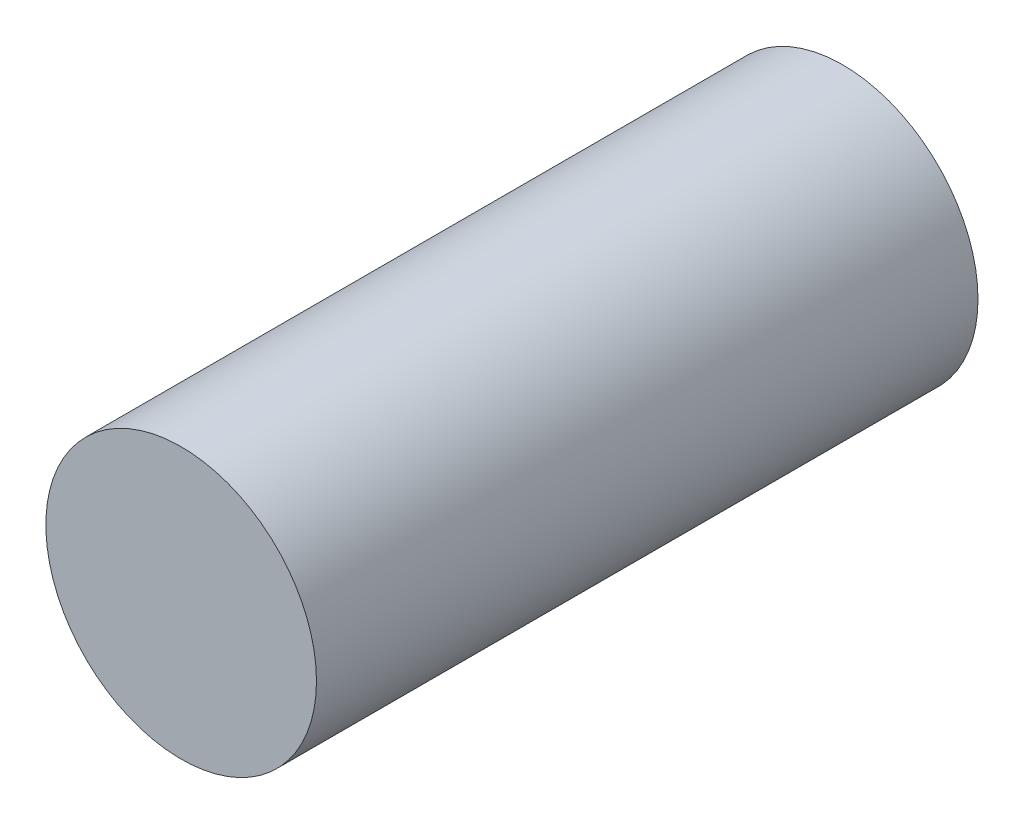
ISO-10303-21;
HEADER;
FILE_DESCRIPTION(('STEP AP214'),'2;1');
FILE_NAME('part.step','',(''),(''),'','','');
FILE_SCHEMA(('AUTOMOTIVE_DESIGN { 1 0 10303 214 1 1 1 1 }'));
ENDSEC;
DATA;
#1=APPLICATION_CONTEXT('core data for automotive mechanical design processes');
#2=APPLICATION_PROTOCOL_DEFINITION('international standard','automotive_design',2000,#1);
#3=PRODUCT_CONTEXT('',#1,'mechanical');
#4=PRODUCT('Part','Part','',(#3));
#5=PRODUCT_RELATED_PRODUCT_CATEGORY('part','',(#4));
#6=PRODUCT_DEFINITION_FORMATION('','',#4);
#7=PRODUCT_DEFINITION_CONTEXT('part definition',#1,'design');
#8=PRODUCT_DEFINITION('design','',#6,#7);
#9=PRODUCT_DEFINITION_SHAPE('','',#8);
#10=(LENGTH_UNIT() NAMED_UNIT(*) SI_UNIT(.MILLI.,.METRE.));
#11=(NAMED_UNIT(*) PLANE_ANGLE_UNIT() SI_UNIT($,.RADIAN.));
#12=(NAMED_UNIT(*) SI_UNIT($,.STERADIAN.) SOLID_ANGLE_UNIT());
#13=UNCERTAINTY_MEASURE_WITH_UNIT(LENGTH_MEASURE(1.E-05),#10,'distance_accuracy_value','');
#14=(GEOMETRIC_REPRESENTATION_CONTEXT(3) GLOBAL_UNCERTAINTY_ASSIGNED_CONTEXT((#13)) GLOBAL_UNIT_ASSIGNED_CONTEXT((#10,
#11,#12)) REPRESENTATION_CONTEXT('',''));
#15=CARTESIAN_POINT('',(0.,0.,0.));
#16=DIRECTION('',(0.,0.,1.));
#17=DIRECTION('',(1.,0.,0.));
#18=AXIS2_PLACEMENT_3D('',#15,#16,#17);
#19=CARTESIAN_POINT('',(0.,0.,22.));
#20=DIRECTION('',(0.,0.,-1.));
#21=DIRECTION('',(-1.,0.,0.));
#22=AXIS2_PLACEMENT_3D('',#19,#20,#21);
#23=CYLINDRICAL_SURFACE('',#22,4.5);
#24=CARTESIAN_POINT('',(0.,0.,22.));
#25=DIRECTION('',(0.,0.,1.));
#26=DIRECTION('',(1.,0.,0.));
#27=AXIS2_PLACEMENT_3D('',#24,#25,#26);
#28=CIRCLE('',#27,4.5);
#29=CARTESIAN_POINT('',(4.5,0.,22.));
#30=VERTEX_POINT('',#29);
#31=EDGE_CURVE('E10',#30,#30,#28,.T.);
#32=ORIENTED_EDGE('',*,*,#31,.F.);
#33=EDGE_LOOP('',(#32));
#34=FACE_BOUND('',#33,.T.);
#35=CARTESIAN_POINT('',(0.,0.,0.));
#36=DIRECTION('',(0.,0.,1.));
#37=DIRECTION('',(1.,0.,0.));
#38=AXIS2_PLACEMENT_3D('',#35,#36,#37);
#39=CIRCLE('',#38,4.5);
#40=CARTESIAN_POINT('',(4.5,0.,0.));
#41=VERTEX_POINT('',#40);
#42=EDGE_CURVE('E42',#41,#41,#39,.T.);
#43=ORIENTED_EDGE('',*,*,#42,.T.);
#44=EDGE_LOOP('',(#43));
#45=FACE_BOUND('',#44,.T.);
#46=ADVANCED_FACE('F39',(#34,#45),#23,.T.);
#47=CARTESIAN_POINT('',(0.,0.,22.));
#48=DIRECTION('',(0.,0.,1.));
#49=DIRECTION('',(1.,0.,0.));
#50=AXIS2_PLACEMENT_3D('',#47,#48,#49);
#51=PLANE('',#50);
#52=ORIENTED_EDGE('',*,*,#31,.T.);
#53=EDGE_LOOP('',(#52));
#54=FACE_BOUND('',#53,.T.);
#55=ADVANCED_FACE('F56',(#54),#51,.T.);
#56=CARTESIAN_POINT('',(0.,0.,0.));
#57=DIRECTION('',(0.,0.,1.));
#58=DIRECTION('',(1.,0.,0.));
#59=AXIS2_PLACEMENT_3D('',#56,#57,#58);
#60=PLANE('',#59);
#61=ORIENTED_EDGE('',*,*,#42,.F.);
#62=EDGE_LOOP('',(#61));
#63=FACE_BOUND('',#62,.T.);
#64=ADVANCED_FACE('F54',(#63),#60,.F.);
#65=CLOSED_SHELL('',(#46,#55,#64));
#66=MANIFOLD_SOLID_BREP('B2',#65);
#67=ADVANCED_BREP_SHAPE_REPRESENTATION('',(#18,#66),#14);
#68=SHAPE_DEFINITION_REPRESENTATION(#9,#67);
ENDSEC;
END-ISO-10303-21;
